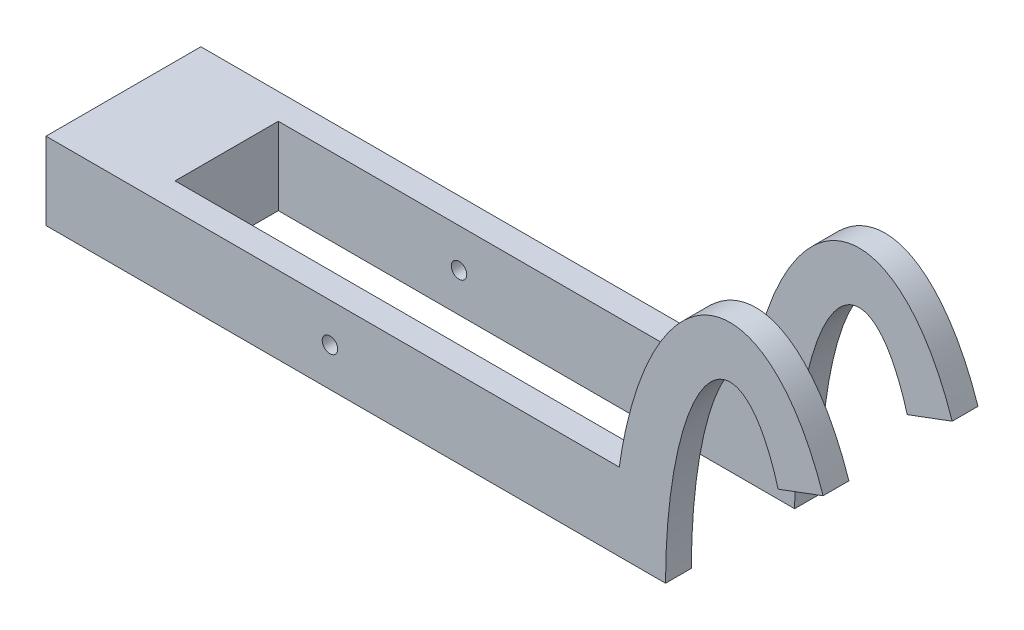
ISO-10303-21;
HEADER;
FILE_DESCRIPTION(('STEP AP214'),'2;1');
FILE_NAME('part.step','',(''),(''),'','','');
FILE_SCHEMA(('AUTOMOTIVE_DESIGN { 1 0 10303 214 1 1 1 1 }'));
ENDSEC;
DATA;
#1=APPLICATION_CONTEXT('core data for automotive mechanical design processes');
#2=APPLICATION_PROTOCOL_DEFINITION('international standard','automotive_design',2000,#1);
#3=PRODUCT_CONTEXT('',#1,'mechanical');
#4=PRODUCT('Part','Part','',(#3));
#5=PRODUCT_RELATED_PRODUCT_CATEGORY('part','',(#4));
#6=PRODUCT_DEFINITION_FORMATION('','',#4);
#7=PRODUCT_DEFINITION_CONTEXT('part definition',#1,'design');
#8=PRODUCT_DEFINITION('design','',#6,#7);
#9=PRODUCT_DEFINITION_SHAPE('','',#8);
#10=(LENGTH_UNIT() NAMED_UNIT(*) SI_UNIT(.MILLI.,.METRE.));
#11=(NAMED_UNIT(*) PLANE_ANGLE_UNIT() SI_UNIT($,.RADIAN.));
#12=(NAMED_UNIT(*) SI_UNIT($,.STERADIAN.) SOLID_ANGLE_UNIT());
#13=UNCERTAINTY_MEASURE_WITH_UNIT(LENGTH_MEASURE(1.E-05),#10,'distance_accuracy_value','');
#14=(GEOMETRIC_REPRESENTATION_CONTEXT(3) GLOBAL_UNCERTAINTY_ASSIGNED_CONTEXT((#13)) GLOBAL_UNIT_ASSIGNED_CONTEXT((#10,
#11,#12)) REPRESENTATION_CONTEXT('',''));
#15=CARTESIAN_POINT('',(0.,0.,0.));
#16=DIRECTION('',(0.,0.,1.));
#17=DIRECTION('',(1.,0.,0.));
#18=AXIS2_PLACEMENT_3D('',#15,#16,#17);
#19=CARTESIAN_POINT('',(168.275,0.,38.1));
#20=DIRECTION('',(0.,0.,-1.));
#21=DIRECTION('',(0.,1.,0.));
#22=AXIS2_PLACEMENT_3D('',#19,#20,#21);
#23=ELLIPSE('',#22,50.8,15.875);
#24=DIRECTION('',(0.,0.,-1.));
#25=VECTOR('',#24,1.);
#26=SURFACE_OF_LINEAR_EXTRUSION('',#23,#25);
#27=DIRECTION('',(0.,0.,-1.));
#28=VECTOR('',#27,1.);
#29=CARTESIAN_POINT('',(152.4,0.,38.1));
#30=LINE('',#29,#28);
#31=CARTESIAN_POINT('',(152.4,0.,38.1));
#32=VERTEX_POINT('',#31);
#33=CARTESIAN_POINT('',(152.4,0.,31.75));
#34=VERTEX_POINT('',#33);
#35=EDGE_CURVE('E161',#32,#34,#30,.T.);
#36=ORIENTED_EDGE('',*,*,#35,.T.);
#37=CARTESIAN_POINT('',(168.275,0.,31.75));
#38=DIRECTION('',(0.,0.,-1.));
#39=DIRECTION('',(0.,1.,0.));
#40=AXIS2_PLACEMENT_3D('',#37,#38,#39);
#41=ELLIPSE('',#40,50.8,15.875);
#42=CARTESIAN_POINT('',(180.098192457485,33.9000311203382,31.75));
#43=VERTEX_POINT('',#42);
#44=EDGE_CURVE('E139',#34,#43,#41,.T.);
#45=ORIENTED_EDGE('',*,*,#44,.T.);
#46=DIRECTION('',(0.,0.,-1.));
#47=VECTOR('',#46,1.);
#48=CARTESIAN_POINT('',(180.098192457485,33.9000311203382,38.1));
#49=LINE('',#48,#47);
#50=CARTESIAN_POINT('',(180.098192457485,33.9000311203382,38.1));
#51=VERTEX_POINT('',#50);
#52=EDGE_CURVE('E157',#51,#43,#49,.T.);
#53=ORIENTED_EDGE('',*,*,#52,.F.);
#54=EDGE_CURVE('E94',#32,#51,#23,.T.);
#55=ORIENTED_EDGE('',*,*,#54,.F.);
#56=EDGE_LOOP('',(#36,#45,#53,#55));
#57=FACE_BOUND('',#56,.T.);
#58=ADVANCED_FACE('F33',(#57),#26,.F.);
#59=CARTESIAN_POINT('',(180.098192457485,33.9000311203382,38.1));
#60=DIRECTION('',(-0.349093526386002,0.937087887999512,0.));
#61=DIRECTION('',(-0.937087887999512,-0.349093526386002,0.));
#62=AXIS2_PLACEMENT_3D('',#59,#60,#61);
#63=PLANE('',#62);
#64=ORIENTED_EDGE('',*,*,#52,.T.);
#65=DIRECTION('',(0.937087887999512,0.349093526386002,0.));
#66=VECTOR('',#65,1.);
#67=CARTESIAN_POINT('',(180.098192457485,33.9000311203382,31.75));
#68=LINE('',#67,#66);
#69=CARTESIAN_POINT('',(191.161472392519,38.0214368661335,31.75));
#70=VERTEX_POINT('',#69);
#71=EDGE_CURVE('E205',#43,#70,#68,.T.);
#72=ORIENTED_EDGE('',*,*,#71,.T.);
#73=DIRECTION('',(0.,0.,-1.));
#74=VECTOR('',#73,1.);
#75=CARTESIAN_POINT('',(191.161472392519,38.0214368661335,38.1));
#76=LINE('',#75,#74);
#77=CARTESIAN_POINT('',(191.161472392519,38.0214368661335,38.1));
#78=VERTEX_POINT('',#77);
#79=EDGE_CURVE('E154',#78,#70,#76,.T.);
#80=ORIENTED_EDGE('',*,*,#79,.F.);
#81=DIRECTION('',(0.937087887999512,0.349093526386002,0.));
#82=VECTOR('',#81,1.);
#83=CARTESIAN_POINT('',(180.098192457485,33.9000311203382,38.1));
#84=LINE('',#83,#82);
#85=EDGE_CURVE('E110',#51,#78,#84,.T.);
#86=ORIENTED_EDGE('',*,*,#85,.F.);
#87=EDGE_LOOP('',(#64,#72,#80,#86));
#88=FACE_BOUND('',#87,.T.);
#89=ADVANCED_FACE('F220',(#88),#63,.F.);
#90=CARTESIAN_POINT('',(168.275,0.,38.1));
#91=DIRECTION('',(0.,0.,1.));
#92=DIRECTION('',(0.,1.,0.));
#93=AXIS2_PLACEMENT_3D('',#90,#91,#92);
#94=ELLIPSE('',#93,63.5,28.575);
#95=DIRECTION('',(0.,0.,-1.));
#96=VECTOR('',#95,1.);
#97=SURFACE_OF_LINEAR_EXTRUSION('',#94,#96);
#98=CARTESIAN_POINT('',(168.275,0.,6.35000000000002));
#99=DIRECTION('',(0.,0.,1.));
#100=DIRECTION('',(0.,1.,0.));
#101=AXIS2_PLACEMENT_3D('',#98,#99,#100);
#102=ELLIPSE('',#101,63.5,28.575);
#103=CARTESIAN_POINT('',(141.016187319511,19.05,6.35000000000002));
#104=VERTEX_POINT('',#103);
#105=CARTESIAN_POINT('',(191.161472392519,38.0214368661335,6.35000000000002));
#106=VERTEX_POINT('',#105);
#107=EDGE_CURVE('E49',#104,#106,#102,.F.);
#108=ORIENTED_EDGE('',*,*,#107,.T.);
#109=CARTESIAN_POINT('',(191.161472392519,38.0214368661335,0.));
#110=VERTEX_POINT('',#109);
#111=EDGE_CURVE('E124',#106,#110,#76,.T.);
#112=ORIENTED_EDGE('',*,*,#111,.T.);
#113=CARTESIAN_POINT('',(168.275,0.,0.));
#114=DIRECTION('',(0.,0.,1.));
#115=DIRECTION('',(0.,1.,0.));
#116=AXIS2_PLACEMENT_3D('',#113,#114,#115);
#117=ELLIPSE('',#116,63.5,28.575);
#118=CARTESIAN_POINT('',(141.016187319511,19.05,0.));
#119=VERTEX_POINT('',#118);
#120=EDGE_CURVE('E145',#110,#119,#117,.T.);
#121=ORIENTED_EDGE('',*,*,#120,.T.);
#122=DIRECTION('',(0.,0.,-1.));
#123=VECTOR('',#122,1.);
#124=CARTESIAN_POINT('',(141.016187319511,19.05,38.1));
#125=LINE('',#124,#123);
#126=EDGE_CURVE('E125',#104,#119,#125,.T.);
#127=ORIENTED_EDGE('',*,*,#126,.F.);
#128=EDGE_LOOP('',(#108,#112,#121,#127));
#129=FACE_BOUND('',#128,.T.);
#130=ADVANCED_FACE('F223',(#129),#97,.F.);
#131=CARTESIAN_POINT('',(0.,0.,38.1));
#132=DIRECTION('',(0.,1.,0.));
#133=DIRECTION('',(-1.,0.,0.));
#134=AXIS2_PLACEMENT_3D('',#131,#132,#133);
#135=PLANE('',#134);
#136=DIRECTION('',(0.,0.,-1.));
#137=VECTOR('',#136,1.);
#138=CARTESIAN_POINT('',(25.4,0.,31.75));
#139=LINE('',#138,#137);
#140=CARTESIAN_POINT('',(25.4,0.,31.75));
#141=VERTEX_POINT('',#140);
#142=CARTESIAN_POINT('',(25.4,0.,6.35));
#143=VERTEX_POINT('',#142);
#144=EDGE_CURVE('E266',#141,#143,#139,.T.);
#145=ORIENTED_EDGE('',*,*,#144,.F.);
#146=DIRECTION('',(-1.,0.,0.));
#147=VECTOR('',#146,1.);
#148=CARTESIAN_POINT('',(25.4,0.,31.75));
#149=LINE('',#148,#147);
#150=EDGE_CURVE('E190',#34,#141,#149,.T.);
#151=ORIENTED_EDGE('',*,*,#150,.F.);
#152=ORIENTED_EDGE('',*,*,#35,.F.);
#153=DIRECTION('',(1.,0.,0.));
#154=VECTOR('',#153,1.);
#155=CARTESIAN_POINT('',(0.,0.,38.1));
#156=LINE('',#155,#154);
#157=CARTESIAN_POINT('',(0.,0.,38.1));
#158=VERTEX_POINT('',#157);
#159=EDGE_CURVE('E151',#158,#32,#156,.T.);
#160=ORIENTED_EDGE('',*,*,#159,.F.);
#161=DIRECTION('',(0.,0.,-1.));
#162=VECTOR('',#161,1.);
#163=CARTESIAN_POINT('',(0.,0.,38.1));
#164=LINE('',#163,#162);
#165=CARTESIAN_POINT('',(0.,0.,0.));
#166=VERTEX_POINT('',#165);
#167=EDGE_CURVE('E130',#158,#166,#164,.T.);
#168=ORIENTED_EDGE('',*,*,#167,.T.);
#169=DIRECTION('',(1.,0.,0.));
#170=VECTOR('',#169,1.);
#171=CARTESIAN_POINT('',(0.,0.,0.));
#172=LINE('',#171,#170);
#173=CARTESIAN_POINT('',(152.4,0.,0.));
#174=VERTEX_POINT('',#173);
#175=EDGE_CURVE('E135',#166,#174,#172,.T.);
#176=ORIENTED_EDGE('',*,*,#175,.T.);
#177=CARTESIAN_POINT('',(152.4,0.,6.35));
#178=VERTEX_POINT('',#177);
#179=EDGE_CURVE('E160',#178,#174,#30,.T.);
#180=ORIENTED_EDGE('',*,*,#179,.F.);
#181=DIRECTION('',(1.,0.,0.));
#182=VECTOR('',#181,1.);
#183=CARTESIAN_POINT('',(25.4,0.,6.35));
#184=LINE('',#183,#182);
#185=EDGE_CURVE('E267',#143,#178,#184,.T.);
#186=ORIENTED_EDGE('',*,*,#185,.F.);
#187=EDGE_LOOP('',(#145,#151,#152,#160,#168,#176,#180,#186));
#188=FACE_BOUND('',#187,.T.);
#189=ADVANCED_FACE('F35',(#188),#135,.F.);
#190=CARTESIAN_POINT('',(180.098192457485,33.9000311203382,6.35));
#191=VERTEX_POINT('',#190);
#192=CARTESIAN_POINT('',(180.098192457485,33.9000311203382,0.));
#193=VERTEX_POINT('',#192);
#194=EDGE_CURVE('E156',#191,#193,#49,.T.);
#195=ORIENTED_EDGE('',*,*,#194,.F.);
#196=CARTESIAN_POINT('',(168.275,0.,6.35000000000002));
#197=DIRECTION('',(0.,0.,-1.));
#198=DIRECTION('',(0.,1.,0.));
#199=AXIS2_PLACEMENT_3D('',#196,#197,#198);
#200=ELLIPSE('',#199,50.8,15.875);
#201=EDGE_CURVE('E201',#191,#178,#200,.F.);
#202=ORIENTED_EDGE('',*,*,#201,.T.);
#203=ORIENTED_EDGE('',*,*,#179,.T.);
#204=CARTESIAN_POINT('',(168.275,0.,0.));
#205=DIRECTION('',(0.,0.,-1.));
#206=DIRECTION('',(0.,1.,0.));
#207=AXIS2_PLACEMENT_3D('',#204,#205,#206);
#208=ELLIPSE('',#207,50.8,15.875);
#209=EDGE_CURVE('E138',#174,#193,#208,.T.);
#210=ORIENTED_EDGE('',*,*,#209,.T.);
#211=EDGE_LOOP('',(#195,#202,#203,#210));
#212=FACE_BOUND('',#211,.T.);
#213=ADVANCED_FACE('F212',(#212),#26,.F.);
#214=ORIENTED_EDGE('',*,*,#111,.F.);
#215=DIRECTION('',(-0.937087887999512,-0.349093526386002,0.));
#216=VECTOR('',#215,1.);
#217=CARTESIAN_POINT('',(180.098192457485,33.9000311203382,6.35));
#218=LINE('',#217,#216);
#219=EDGE_CURVE('E193',#106,#191,#218,.T.);
#220=ORIENTED_EDGE('',*,*,#219,.T.);
#221=ORIENTED_EDGE('',*,*,#194,.T.);
#222=DIRECTION('',(0.937087887999512,0.349093526386002,0.));
#223=VECTOR('',#222,1.);
#224=CARTESIAN_POINT('',(180.098192457485,33.9000311203382,0.));
#225=LINE('',#224,#223);
#226=EDGE_CURVE('E142',#193,#110,#225,.T.);
#227=ORIENTED_EDGE('',*,*,#226,.T.);
#228=EDGE_LOOP('',(#214,#220,#221,#227));
#229=FACE_BOUND('',#228,.T.);
#230=ADVANCED_FACE('F215',(#229),#63,.F.);
#231=CARTESIAN_POINT('',(168.275,0.,31.75));
#232=DIRECTION('',(0.,0.,1.));
#233=DIRECTION('',(0.,1.,0.));
#234=AXIS2_PLACEMENT_3D('',#231,#232,#233);
#235=ELLIPSE('',#234,63.5,28.575);
#236=CARTESIAN_POINT('',(141.016187319511,19.05,31.75));
#237=VERTEX_POINT('',#236);
#238=EDGE_CURVE('E121',#70,#237,#235,.T.);
#239=ORIENTED_EDGE('',*,*,#238,.T.);
#240=CARTESIAN_POINT('',(141.016187319511,19.05,38.1));
#241=VERTEX_POINT('',#240);
#242=EDGE_CURVE('E117',#241,#237,#125,.T.);
#243=ORIENTED_EDGE('',*,*,#242,.F.);
#244=EDGE_CURVE('E103',#78,#241,#94,.T.);
#245=ORIENTED_EDGE('',*,*,#244,.F.);
#246=ORIENTED_EDGE('',*,*,#79,.T.);
#247=EDGE_LOOP('',(#239,#243,#245,#246));
#248=FACE_BOUND('',#247,.T.);
#249=ADVANCED_FACE('F118',(#248),#97,.F.);
#250=CARTESIAN_POINT('',(0.,19.05,38.1));
#251=DIRECTION('',(0.,-1.,0.));
#252=DIRECTION('',(1.,0.,0.));
#253=AXIS2_PLACEMENT_3D('',#250,#251,#252);
#254=PLANE('',#253);
#255=ORIENTED_EDGE('',*,*,#242,.T.);
#256=DIRECTION('',(-1.,0.,0.));
#257=VECTOR('',#256,1.);
#258=CARTESIAN_POINT('',(0.,19.05,31.75));
#259=LINE('',#258,#257);
#260=CARTESIAN_POINT('',(25.4,19.05,31.75));
#261=VERTEX_POINT('',#260);
#262=EDGE_CURVE('E11',#237,#261,#259,.T.);
#263=ORIENTED_EDGE('',*,*,#262,.T.);
#264=DIRECTION('',(0.,0.,-1.));
#265=VECTOR('',#264,1.);
#266=CARTESIAN_POINT('',(25.4,19.05,38.1));
#267=LINE('',#266,#265);
#268=CARTESIAN_POINT('',(25.4,19.05,6.35));
#269=VERTEX_POINT('',#268);
#270=EDGE_CURVE('E42',#261,#269,#267,.T.);
#271=ORIENTED_EDGE('',*,*,#270,.T.);
#272=DIRECTION('',(1.,0.,0.));
#273=VECTOR('',#272,1.);
#274=CARTESIAN_POINT('',(0.,19.05,6.35));
#275=LINE('',#274,#273);
#276=EDGE_CURVE('E163',#269,#104,#275,.T.);
#277=ORIENTED_EDGE('',*,*,#276,.T.);
#278=ORIENTED_EDGE('',*,*,#126,.T.);
#279=DIRECTION('',(-1.,0.,0.));
#280=VECTOR('',#279,1.);
#281=CARTESIAN_POINT('',(0.,19.05,0.));
#282=LINE('',#281,#280);
#283=CARTESIAN_POINT('',(0.,19.05,0.));
#284=VERTEX_POINT('',#283);
#285=EDGE_CURVE('E148',#119,#284,#282,.T.);
#286=ORIENTED_EDGE('',*,*,#285,.T.);
#287=DIRECTION('',(0.,0.,-1.));
#288=VECTOR('',#287,1.);
#289=CARTESIAN_POINT('',(0.,19.05,38.1));
#290=LINE('',#289,#288);
#291=CARTESIAN_POINT('',(0.,19.05,38.1));
#292=VERTEX_POINT('',#291);
#293=EDGE_CURVE('E128',#292,#284,#290,.T.);
#294=ORIENTED_EDGE('',*,*,#293,.F.);
#295=DIRECTION('',(-1.,0.,0.));
#296=VECTOR('',#295,1.);
#297=CARTESIAN_POINT('',(0.,19.05,38.1));
#298=LINE('',#297,#296);
#299=EDGE_CURVE('E107',#241,#292,#298,.T.);
#300=ORIENTED_EDGE('',*,*,#299,.F.);
#301=EDGE_LOOP('',(#255,#263,#271,#277,#278,#286,#294,#300));
#302=FACE_BOUND('',#301,.T.);
#303=ADVANCED_FACE('F127',(#302),#254,.F.);
#304=CARTESIAN_POINT('',(0.,0.,38.1));
#305=DIRECTION('',(1.,0.,0.));
#306=DIRECTION('',(0.,0.,-1.));
#307=AXIS2_PLACEMENT_3D('',#304,#305,#306);
#308=PLANE('',#307);
#309=DIRECTION('',(0.,-1.,0.));
#310=VECTOR('',#309,1.);
#311=CARTESIAN_POINT('',(0.,0.,0.));
#312=LINE('',#311,#310);
#313=EDGE_CURVE('E85',#284,#166,#312,.T.);
#314=ORIENTED_EDGE('',*,*,#313,.T.);
#315=ORIENTED_EDGE('',*,*,#167,.F.);
#316=DIRECTION('',(0.,-1.,0.));
#317=VECTOR('',#316,1.);
#318=CARTESIAN_POINT('',(0.,0.,38.1));
#319=LINE('',#318,#317);
#320=EDGE_CURVE('E58',#292,#158,#319,.T.);
#321=ORIENTED_EDGE('',*,*,#320,.F.);
#322=ORIENTED_EDGE('',*,*,#293,.T.);
#323=EDGE_LOOP('',(#314,#315,#321,#322));
#324=FACE_BOUND('',#323,.T.);
#325=ADVANCED_FACE('F226',(#324),#308,.F.);
#326=CARTESIAN_POINT('',(168.275,0.,38.1));
#327=DIRECTION('',(0.,0.,1.));
#328=DIRECTION('',(1.,0.,0.));
#329=AXIS2_PLACEMENT_3D('',#326,#327,#328);
#330=PLANE('',#329);
#331=CARTESIAN_POINT('',(69.85,9.525,38.1));
#332=DIRECTION('',(0.,0.,1.));
#333=DIRECTION('',(1.,0.,0.));
#334=AXIS2_PLACEMENT_3D('',#331,#332,#333);
#335=CIRCLE('',#334,1.90500000000001);
#336=CARTESIAN_POINT('',(71.755,9.525,38.1));
#337=VERTEX_POINT('',#336);
#338=EDGE_CURVE('E275',#337,#337,#335,.T.);
#339=ORIENTED_EDGE('',*,*,#338,.F.);
#340=EDGE_LOOP('',(#339));
#341=FACE_BOUND('',#340,.T.);
#342=ORIENTED_EDGE('',*,*,#159,.T.);
#343=ORIENTED_EDGE('',*,*,#54,.T.);
#344=ORIENTED_EDGE('',*,*,#85,.T.);
#345=ORIENTED_EDGE('',*,*,#244,.T.);
#346=ORIENTED_EDGE('',*,*,#299,.T.);
#347=ORIENTED_EDGE('',*,*,#320,.T.);
#348=EDGE_LOOP('',(#342,#343,#344,#345,#346,#347));
#349=FACE_BOUND('',#348,.T.);
#350=ADVANCED_FACE('F105',(#341,#349),#330,.T.);
#351=CARTESIAN_POINT('',(168.275,0.,0.));
#352=DIRECTION('',(0.,0.,1.));
#353=DIRECTION('',(1.,0.,0.));
#354=AXIS2_PLACEMENT_3D('',#351,#352,#353);
#355=PLANE('',#354);
#356=CARTESIAN_POINT('',(69.85,9.525,0.));
#357=DIRECTION('',(0.,0.,1.));
#358=DIRECTION('',(1.,0.,0.));
#359=AXIS2_PLACEMENT_3D('',#356,#357,#358);
#360=CIRCLE('',#359,1.90500000000001);
#361=CARTESIAN_POINT('',(71.755,9.525,0.));
#362=VERTEX_POINT('',#361);
#363=EDGE_CURVE('E277',#362,#362,#360,.T.);
#364=ORIENTED_EDGE('',*,*,#363,.T.);
#365=EDGE_LOOP('',(#364));
#366=FACE_BOUND('',#365,.T.);
#367=ORIENTED_EDGE('',*,*,#175,.F.);
#368=ORIENTED_EDGE('',*,*,#313,.F.);
#369=ORIENTED_EDGE('',*,*,#285,.F.);
#370=ORIENTED_EDGE('',*,*,#120,.F.);
#371=ORIENTED_EDGE('',*,*,#226,.F.);
#372=ORIENTED_EDGE('',*,*,#209,.F.);
#373=EDGE_LOOP('',(#367,#368,#369,#370,#371,#372));
#374=FACE_BOUND('',#373,.T.);
#375=ADVANCED_FACE('F229',(#366,#374),#355,.F.);
#376=CARTESIAN_POINT('',(25.4,63.5,31.75));
#377=DIRECTION('',(-1.,0.,0.));
#378=DIRECTION('',(0.,0.,1.));
#379=AXIS2_PLACEMENT_3D('',#376,#377,#378);
#380=PLANE('',#379);
#381=DIRECTION('',(0.,-1.,0.));
#382=VECTOR('',#381,1.);
#383=CARTESIAN_POINT('',(25.4,63.5,31.75));
#384=LINE('',#383,#382);
#385=EDGE_CURVE('E180',#261,#141,#384,.T.);
#386=ORIENTED_EDGE('',*,*,#385,.T.);
#387=ORIENTED_EDGE('',*,*,#144,.T.);
#388=DIRECTION('',(0.,-1.,0.));
#389=VECTOR('',#388,1.);
#390=CARTESIAN_POINT('',(25.4,63.5,6.35));
#391=LINE('',#390,#389);
#392=EDGE_CURVE('E183',#269,#143,#391,.T.);
#393=ORIENTED_EDGE('',*,*,#392,.F.);
#394=ORIENTED_EDGE('',*,*,#270,.F.);
#395=EDGE_LOOP('',(#386,#387,#393,#394));
#396=FACE_BOUND('',#395,.T.);
#397=ADVANCED_FACE('F177',(#396),#380,.F.);
#398=CARTESIAN_POINT('',(25.4,63.5,31.75));
#399=DIRECTION('',(0.,0.,1.));
#400=DIRECTION('',(1.,0.,0.));
#401=AXIS2_PLACEMENT_3D('',#398,#399,#400);
#402=PLANE('',#401);
#403=CARTESIAN_POINT('',(69.85,9.525,31.75));
#404=DIRECTION('',(0.,0.,1.));
#405=DIRECTION('',(1.,0.,0.));
#406=AXIS2_PLACEMENT_3D('',#403,#404,#405);
#407=CIRCLE('',#406,1.90500000000001);
#408=CARTESIAN_POINT('',(71.755,9.525,31.75));
#409=VERTEX_POINT('',#408);
#410=EDGE_CURVE('E270',#409,#409,#407,.T.);
#411=ORIENTED_EDGE('',*,*,#410,.T.);
#412=EDGE_LOOP('',(#411));
#413=FACE_BOUND('',#412,.T.);
#414=ORIENTED_EDGE('',*,*,#150,.T.);
#415=ORIENTED_EDGE('',*,*,#385,.F.);
#416=ORIENTED_EDGE('',*,*,#262,.F.);
#417=ORIENTED_EDGE('',*,*,#238,.F.);
#418=ORIENTED_EDGE('',*,*,#71,.F.);
#419=ORIENTED_EDGE('',*,*,#44,.F.);
#420=EDGE_LOOP('',(#414,#415,#416,#417,#418,#419));
#421=FACE_BOUND('',#420,.T.);
#422=ADVANCED_FACE('F187',(#413,#421),#402,.F.);
#423=CARTESIAN_POINT('',(25.4,63.5,6.35));
#424=DIRECTION('',(0.,0.,-1.));
#425=DIRECTION('',(-1.,0.,0.));
#426=AXIS2_PLACEMENT_3D('',#423,#424,#425);
#427=PLANE('',#426);
#428=CARTESIAN_POINT('',(69.85,9.525,6.35));
#429=DIRECTION('',(0.,0.,-1.));
#430=DIRECTION('',(-1.,0.,0.));
#431=AXIS2_PLACEMENT_3D('',#428,#429,#430);
#432=CIRCLE('',#431,1.90500000000001);
#433=CARTESIAN_POINT('',(71.755,9.525,6.35));
#434=VERTEX_POINT('',#433);
#435=EDGE_CURVE('E37',#434,#434,#432,.T.);
#436=ORIENTED_EDGE('',*,*,#435,.T.);
#437=EDGE_LOOP('',(#436));
#438=FACE_BOUND('',#437,.T.);
#439=ORIENTED_EDGE('',*,*,#219,.F.);
#440=ORIENTED_EDGE('',*,*,#107,.F.);
#441=ORIENTED_EDGE('',*,*,#276,.F.);
#442=ORIENTED_EDGE('',*,*,#392,.T.);
#443=ORIENTED_EDGE('',*,*,#185,.T.);
#444=ORIENTED_EDGE('',*,*,#201,.F.);
#445=EDGE_LOOP('',(#439,#440,#441,#442,#443,#444));
#446=FACE_BOUND('',#445,.T.);
#447=ADVANCED_FACE('F238',(#438,#446),#427,.F.);
#448=CARTESIAN_POINT('',(69.85,9.525,0.));
#449=DIRECTION('',(0.,0.,1.));
#450=DIRECTION('',(1.,0.,0.));
#451=AXIS2_PLACEMENT_3D('',#448,#449,#450);
#452=CYLINDRICAL_SURFACE('',#451,1.90500000000001);
#453=CARTESIAN_POINT('',(71.755,9.525,0.));
#454=CARTESIAN_POINT('',(71.755,9.525,0.0661458333333334));
#455=CARTESIAN_POINT('',(71.755,9.525,0.132291666666667));
#456=CARTESIAN_POINT('',(71.755,9.525,0.264583333333333));
#457=CARTESIAN_POINT('',(71.755,9.525,0.330729166666667));
#458=CARTESIAN_POINT('',(71.755,9.525,0.463020833333333));
#459=CARTESIAN_POINT('',(71.755,9.525,0.529166666666667));
#460=CARTESIAN_POINT('',(71.755,9.525,0.661458333333334));
#461=CARTESIAN_POINT('',(71.755,9.525,0.727604166666667));
#462=CARTESIAN_POINT('',(71.755,9.525,0.859895833333334));
#463=CARTESIAN_POINT('',(71.755,9.525,0.926041666666667));
#464=CARTESIAN_POINT('',(71.755,9.525,1.05833333333333));
#465=CARTESIAN_POINT('',(71.755,9.525,1.12447916666667));
#466=CARTESIAN_POINT('',(71.755,9.525,1.25677083333333));
#467=CARTESIAN_POINT('',(71.755,9.525,1.32291666666667));
#468=CARTESIAN_POINT('',(71.755,9.525,1.45520833333333));
#469=CARTESIAN_POINT('',(71.755,9.525,1.52135416666667));
#470=CARTESIAN_POINT('',(71.755,9.525,1.65364583333333));
#471=CARTESIAN_POINT('',(71.755,9.525,1.71979166666667));
#472=CARTESIAN_POINT('',(71.755,9.525,1.85208333333333));
#473=CARTESIAN_POINT('',(71.755,9.525,1.91822916666667));
#474=CARTESIAN_POINT('',(71.755,9.525,2.05052083333333));
#475=CARTESIAN_POINT('',(71.755,9.525,2.11666666666667));
#476=CARTESIAN_POINT('',(71.755,9.525,2.24895833333333));
#477=CARTESIAN_POINT('',(71.755,9.525,2.31510416666667));
#478=CARTESIAN_POINT('',(71.755,9.525,2.44739583333333));
#479=CARTESIAN_POINT('',(71.755,9.525,2.51354166666667));
#480=CARTESIAN_POINT('',(71.755,9.525,2.64583333333333));
#481=CARTESIAN_POINT('',(71.755,9.525,2.71197916666667));
#482=CARTESIAN_POINT('',(71.755,9.525,2.84427083333333));
#483=CARTESIAN_POINT('',(71.755,9.525,2.91041666666667));
#484=CARTESIAN_POINT('',(71.755,9.525,3.04270833333333));
#485=CARTESIAN_POINT('',(71.755,9.525,3.10885416666667));
#486=CARTESIAN_POINT('',(71.755,9.525,3.24114583333333));
#487=CARTESIAN_POINT('',(71.755,9.525,3.30729166666667));
#488=CARTESIAN_POINT('',(71.755,9.525,3.43958333333333));
#489=CARTESIAN_POINT('',(71.755,9.525,3.50572916666667));
#490=CARTESIAN_POINT('',(71.755,9.525,3.63802083333333));
#491=CARTESIAN_POINT('',(71.755,9.525,3.70416666666667));
#492=CARTESIAN_POINT('',(71.755,9.525,3.83645833333333));
#493=CARTESIAN_POINT('',(71.755,9.525,3.90260416666667));
#494=CARTESIAN_POINT('',(71.755,9.525,4.03489583333333));
#495=CARTESIAN_POINT('',(71.755,9.525,4.10104166666667));
#496=CARTESIAN_POINT('',(71.755,9.525,4.23333333333333));
#497=CARTESIAN_POINT('',(71.755,9.525,4.29947916666667));
#498=CARTESIAN_POINT('',(71.755,9.525,4.43177083333333));
#499=CARTESIAN_POINT('',(71.755,9.525,4.49791666666667));
#500=CARTESIAN_POINT('',(71.755,9.525,4.63020833333333));
#501=CARTESIAN_POINT('',(71.755,9.525,4.69635416666667));
#502=CARTESIAN_POINT('',(71.755,9.525,4.82864583333333));
#503=CARTESIAN_POINT('',(71.755,9.525,4.89479166666667));
#504=CARTESIAN_POINT('',(71.755,9.525,5.02708333333333));
#505=CARTESIAN_POINT('',(71.755,9.525,5.09322916666667));
#506=CARTESIAN_POINT('',(71.755,9.525,5.22552083333333));
#507=CARTESIAN_POINT('',(71.755,9.525,5.29166666666667));
#508=CARTESIAN_POINT('',(71.755,9.525,5.42395833333333));
#509=CARTESIAN_POINT('',(71.755,9.525,5.49010416666667));
#510=CARTESIAN_POINT('',(71.755,9.525,5.62239583333333));
#511=CARTESIAN_POINT('',(71.755,9.525,5.68854166666667));
#512=CARTESIAN_POINT('',(71.755,9.525,5.82083333333333));
#513=CARTESIAN_POINT('',(71.755,9.525,5.88697916666667));
#514=CARTESIAN_POINT('',(71.755,9.525,6.01927083333334));
#515=CARTESIAN_POINT('',(71.755,9.525,6.08541666666667));
#516=CARTESIAN_POINT('',(71.755,9.525,6.21770833333334));
#517=CARTESIAN_POINT('',(71.755,9.525,6.28385416666667));
#518=CARTESIAN_POINT('',(71.755,9.525,6.35));
#519=B_SPLINE_CURVE_WITH_KNOTS('',3,(#453,#454,#455,#456,#457,#458,#459,#460,#461,#462,#463,
#464,#465,#466,#467,#468,#469,#470,#471,#472,#473,#474,#475,#476,#477,#478,#479,#480,#481,#482,
#483,#484,#485,#486,#487,#488,#489,#490,#491,#492,#493,#494,#495,#496,#497,#498,#499,#500,#501,
#502,#503,#504,#505,#506,#507,#508,#509,#510,#511,#512,#513,#514,#515,#516,#517,#518),
.UNSPECIFIED.,.F.,.F.,(4,2,2,2,2,2,2,2,2,2,2,2,2,2,2,2,2,2,2,2,2,2,2,2,2,2,2,2,2,2,2,2,4),(0.,
0.1984375,0.396875,0.5953125,0.79375,0.9921875,1.190625,1.3890625,1.5875,1.7859375,1.984375,
2.1828125,2.38125,2.5796875,2.778125,2.9765625,3.175,3.3734375,3.571875,3.7703125,3.96875,
4.1671875,4.365625,4.5640625,4.7625,4.9609375,5.159375,5.3578125,5.55625,5.7546875,5.953125,
6.1515625,6.35),.UNSPECIFIED.);
#520=EDGE_CURVE('BSEAM241',#362,#434,#519,.T.);
#521=ORIENTED_EDGE('',*,*,#363,.F.);
#522=ORIENTED_EDGE('',*,*,#435,.F.);
#523=ORIENTED_EDGE('',*,*,#520,.T.);
#524=ORIENTED_EDGE('',*,*,#520,.F.);
#525=EDGE_LOOP('',(#521,#523,#522,#524));
#526=FACE_BOUND('',#525,.T.);
#527=ADVANCED_FACE('F241',(#526),#452,.F.);
#528=CARTESIAN_POINT('',(71.755,9.525,38.1));
#529=CARTESIAN_POINT('',(71.755,9.525,38.0338541666667));
#530=CARTESIAN_POINT('',(71.755,9.525,37.9677083333333));
#531=CARTESIAN_POINT('',(71.755,9.525,37.8354166666667));
#532=CARTESIAN_POINT('',(71.755,9.525,37.7692708333333));
#533=CARTESIAN_POINT('',(71.755,9.525,37.6369791666667));
#534=CARTESIAN_POINT('',(71.755,9.525,37.5708333333333));
#535=CARTESIAN_POINT('',(71.755,9.525,37.4385416666667));
#536=CARTESIAN_POINT('',(71.755,9.525,37.3723958333333));
#537=CARTESIAN_POINT('',(71.755,9.525,37.2401041666667));
#538=CARTESIAN_POINT('',(71.755,9.525,37.1739583333333));
#539=CARTESIAN_POINT('',(71.755,9.525,37.0416666666667));
#540=CARTESIAN_POINT('',(71.755,9.525,36.9755208333333));
#541=CARTESIAN_POINT('',(71.755,9.525,36.8432291666667));
#542=CARTESIAN_POINT('',(71.755,9.525,36.7770833333333));
#543=CARTESIAN_POINT('',(71.755,9.525,36.6447916666667));
#544=CARTESIAN_POINT('',(71.755,9.525,36.5786458333333));
#545=CARTESIAN_POINT('',(71.755,9.525,36.4463541666667));
#546=CARTESIAN_POINT('',(71.755,9.525,36.3802083333333));
#547=CARTESIAN_POINT('',(71.755,9.525,36.2479166666667));
#548=CARTESIAN_POINT('',(71.755,9.525,36.1817708333333));
#549=CARTESIAN_POINT('',(71.755,9.525,36.0494791666667));
#550=CARTESIAN_POINT('',(71.755,9.525,35.9833333333333));
#551=CARTESIAN_POINT('',(71.755,9.525,35.8510416666667));
#552=CARTESIAN_POINT('',(71.755,9.525,35.7848958333333));
#553=CARTESIAN_POINT('',(71.755,9.525,35.6526041666667));
#554=CARTESIAN_POINT('',(71.755,9.525,35.5864583333333));
#555=CARTESIAN_POINT('',(71.755,9.525,35.4541666666667));
#556=CARTESIAN_POINT('',(71.755,9.525,35.3880208333333));
#557=CARTESIAN_POINT('',(71.755,9.525,35.2557291666667));
#558=CARTESIAN_POINT('',(71.755,9.525,35.1895833333333));
#559=CARTESIAN_POINT('',(71.755,9.525,35.0572916666667));
#560=CARTESIAN_POINT('',(71.755,9.525,34.9911458333333));
#561=CARTESIAN_POINT('',(71.755,9.525,34.8588541666667));
#562=CARTESIAN_POINT('',(71.755,9.525,34.7927083333333));
#563=CARTESIAN_POINT('',(71.755,9.525,34.6604166666667));
#564=CARTESIAN_POINT('',(71.755,9.525,34.5942708333333));
#565=CARTESIAN_POINT('',(71.755,9.525,34.4619791666667));
#566=CARTESIAN_POINT('',(71.755,9.525,34.3958333333333));
#567=CARTESIAN_POINT('',(71.755,9.525,34.2635416666667));
#568=CARTESIAN_POINT('',(71.755,9.525,34.1973958333333));
#569=CARTESIAN_POINT('',(71.755,9.525,34.0651041666667));
#570=CARTESIAN_POINT('',(71.755,9.525,33.9989583333333));
#571=CARTESIAN_POINT('',(71.755,9.525,33.8666666666667));
#572=CARTESIAN_POINT('',(71.755,9.525,33.8005208333333));
#573=CARTESIAN_POINT('',(71.755,9.525,33.6682291666667));
#574=CARTESIAN_POINT('',(71.755,9.525,33.6020833333333));
#575=CARTESIAN_POINT('',(71.755,9.525,33.4697916666667));
#576=CARTESIAN_POINT('',(71.755,9.525,33.4036458333333));
#577=CARTESIAN_POINT('',(71.755,9.525,33.2713541666667));
#578=CARTESIAN_POINT('',(71.755,9.525,33.2052083333333));
#579=CARTESIAN_POINT('',(71.755,9.525,33.0729166666667));
#580=CARTESIAN_POINT('',(71.755,9.525,33.0067708333333));
#581=CARTESIAN_POINT('',(71.755,9.525,32.8744791666667));
#582=CARTESIAN_POINT('',(71.755,9.525,32.8083333333333));
#583=CARTESIAN_POINT('',(71.755,9.525,32.6760416666667));
#584=CARTESIAN_POINT('',(71.755,9.525,32.6098958333333));
#585=CARTESIAN_POINT('',(71.755,9.525,32.4776041666667));
#586=CARTESIAN_POINT('',(71.755,9.525,32.4114583333333));
#587=CARTESIAN_POINT('',(71.755,9.525,32.2791666666667));
#588=CARTESIAN_POINT('',(71.755,9.525,32.2130208333333));
#589=CARTESIAN_POINT('',(71.755,9.525,32.0807291666667));
#590=CARTESIAN_POINT('',(71.755,9.525,32.0145833333333));
#591=CARTESIAN_POINT('',(71.755,9.525,31.8822916666667));
#592=CARTESIAN_POINT('',(71.755,9.525,31.8161458333333));
#593=CARTESIAN_POINT('',(71.755,9.525,31.75));
#594=B_SPLINE_CURVE_WITH_KNOTS('',3,(#528,#529,#530,#531,#532,#533,#534,#535,#536,#537,#538,
#539,#540,#541,#542,#543,#544,#545,#546,#547,#548,#549,#550,#551,#552,#553,#554,#555,#556,#557,
#558,#559,#560,#561,#562,#563,#564,#565,#566,#567,#568,#569,#570,#571,#572,#573,#574,#575,#576,
#577,#578,#579,#580,#581,#582,#583,#584,#585,#586,#587,#588,#589,#590,#591,#592,#593),
.UNSPECIFIED.,.F.,.F.,(4,2,2,2,2,2,2,2,2,2,2,2,2,2,2,2,2,2,2,2,2,2,2,2,2,2,2,2,2,2,2,2,4),(0.,
0.198437500000002,0.396874999999998,0.5953125,0.793750000000003,0.992187499999998,1.190625,
1.3890625,1.58750000000001,1.7859375,1.984375,2.18281250000001,2.38125,2.5796875,
2.77812500000001,2.9765625,3.175,3.37343750000001,3.571875,3.7703125,3.96875000000001,4.1671875,
4.365625,4.56406250000001,4.7625,4.96093750000001,5.15937500000001,5.3578125,5.55625000000001,
5.75468750000001,5.95312500000001,6.15156250000001,6.35000000000001),.UNSPECIFIED.);
#595=EDGE_CURVE('BSEAM246',#337,#409,#594,.T.);
#596=ORIENTED_EDGE('',*,*,#338,.T.);
#597=ORIENTED_EDGE('',*,*,#410,.F.);
#598=ORIENTED_EDGE('',*,*,#595,.T.);
#599=ORIENTED_EDGE('',*,*,#595,.F.);
#600=EDGE_LOOP('',(#596,#598,#597,#599));
#601=FACE_BOUND('',#600,.T.);
#602=ADVANCED_FACE('F246',(#601),#452,.F.);
#603=CLOSED_SHELL('',(#58,#89,#130,#189,#213,#230,#249,#303,#325,#350,#375,#397,#422,#447,#527,#602));
#604=MANIFOLD_SOLID_BREP('B2',#603);
#605=ADVANCED_BREP_SHAPE_REPRESENTATION('',(#18,#604),#14);
#606=SHAPE_DEFINITION_REPRESENTATION(#9,#605);
ENDSEC;
END-ISO-10303-21;
